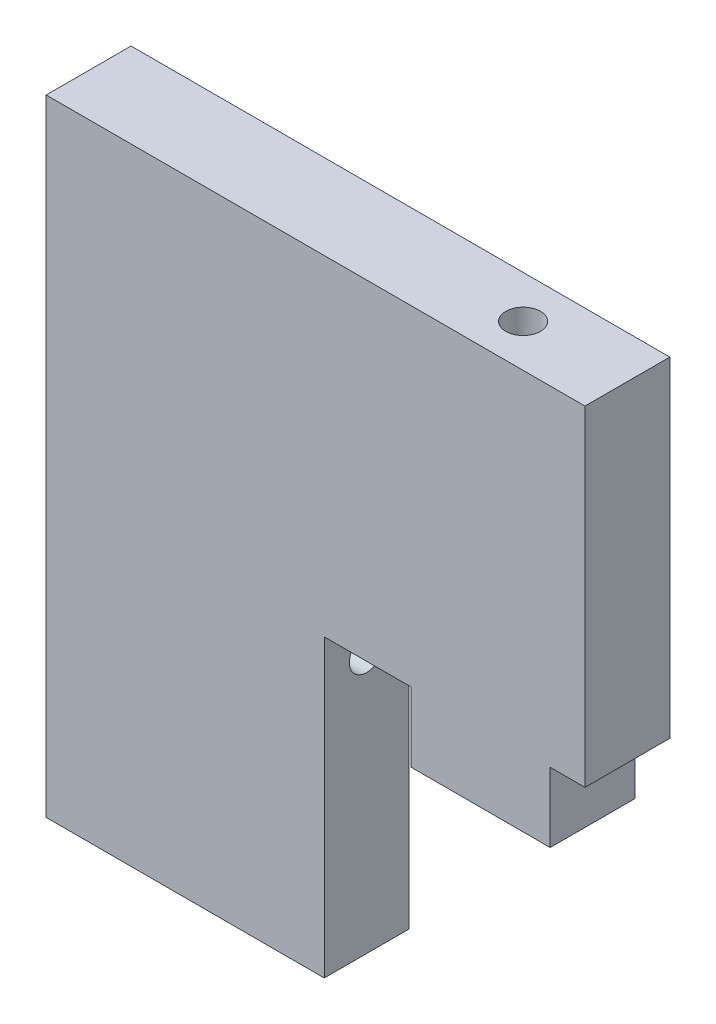
ISO-10303-21;
HEADER;
FILE_DESCRIPTION(('STEP AP214'),'2;1');
FILE_NAME('part.step','',(''),(''),'','','');
FILE_SCHEMA(('AUTOMOTIVE_DESIGN { 1 0 10303 214 1 1 1 1 }'));
ENDSEC;
DATA;
#1=APPLICATION_CONTEXT('core data for automotive mechanical design processes');
#2=APPLICATION_PROTOCOL_DEFINITION('international standard','automotive_design',2000,#1);
#3=PRODUCT_CONTEXT('',#1,'mechanical');
#4=PRODUCT('Part','Part','',(#3));
#5=PRODUCT_RELATED_PRODUCT_CATEGORY('part','',(#4));
#6=PRODUCT_DEFINITION_FORMATION('','',#4);
#7=PRODUCT_DEFINITION_CONTEXT('part definition',#1,'design');
#8=PRODUCT_DEFINITION('design','',#6,#7);
#9=PRODUCT_DEFINITION_SHAPE('','',#8);
#10=(LENGTH_UNIT() NAMED_UNIT(*) SI_UNIT(.MILLI.,.METRE.));
#11=(NAMED_UNIT(*) PLANE_ANGLE_UNIT() SI_UNIT($,.RADIAN.));
#12=(NAMED_UNIT(*) SI_UNIT($,.STERADIAN.) SOLID_ANGLE_UNIT());
#13=UNCERTAINTY_MEASURE_WITH_UNIT(LENGTH_MEASURE(1.E-05),#10,'distance_accuracy_value','');
#14=(GEOMETRIC_REPRESENTATION_CONTEXT(3) GLOBAL_UNCERTAINTY_ASSIGNED_CONTEXT((#13)) GLOBAL_UNIT_ASSIGNED_CONTEXT((#10,
#11,#12)) REPRESENTATION_CONTEXT('',''));
#15=CARTESIAN_POINT('',(0.,0.,0.));
#16=DIRECTION('',(0.,0.,1.));
#17=DIRECTION('',(1.,0.,0.));
#18=AXIS2_PLACEMENT_3D('',#15,#16,#17);
#19=CARTESIAN_POINT('',(76.2,266.7,31.));
#20=DIRECTION('',(-1.,0.,0.));
#21=DIRECTION('',(0.,-1.,0.));
#22=AXIS2_PLACEMENT_3D('',#19,#20,#21);
#23=PLANE('',#22);
#24=DIRECTION('',(0.,1.,0.));
#25=VECTOR('',#24,1.);
#26=CARTESIAN_POINT('',(76.2,266.7,-31.));
#27=LINE('',#26,#25);
#28=CARTESIAN_POINT('',(76.2,25.4,-31.));
#29=VERTEX_POINT('',#28);
#30=CARTESIAN_POINT('',(76.2,266.7,-31.));
#31=VERTEX_POINT('',#30);
#32=EDGE_CURVE('E161',#29,#31,#27,.T.);
#33=ORIENTED_EDGE('',*,*,#32,.T.);
#34=DIRECTION('',(0.,0.,-1.));
#35=VECTOR('',#34,1.);
#36=CARTESIAN_POINT('',(76.2,266.7,31.));
#37=LINE('',#36,#35);
#38=CARTESIAN_POINT('',(76.2,266.7,31.));
#39=VERTEX_POINT('',#38);
#40=EDGE_CURVE('E200',#39,#31,#37,.T.);
#41=ORIENTED_EDGE('',*,*,#40,.F.);
#42=DIRECTION('',(0.,1.,0.));
#43=VECTOR('',#42,1.);
#44=CARTESIAN_POINT('',(76.2,266.7,31.));
#45=LINE('',#44,#43);
#46=CARTESIAN_POINT('',(76.2,25.4,31.));
#47=VERTEX_POINT('',#46);
#48=EDGE_CURVE('E181',#47,#39,#45,.T.);
#49=ORIENTED_EDGE('',*,*,#48,.F.);
#50=DIRECTION('',(0.,0.,-1.));
#51=VECTOR('',#50,1.);
#52=CARTESIAN_POINT('',(76.2,25.4,31.));
#53=LINE('',#52,#51);
#54=EDGE_CURVE('E157',#47,#29,#53,.T.);
#55=ORIENTED_EDGE('',*,*,#54,.T.);
#56=EDGE_LOOP('',(#33,#41,#49,#55));
#57=FACE_BOUND('',#56,.T.);
#58=ADVANCED_FACE('F44',(#57),#23,.F.);
#59=CARTESIAN_POINT('',(76.2,266.7,31.));
#60=DIRECTION('',(0.,-1.,0.));
#61=DIRECTION('',(1.,0.,0.));
#62=AXIS2_PLACEMENT_3D('',#59,#60,#61);
#63=PLANE('',#62);
#64=CARTESIAN_POINT('',(0.,266.7,0.));
#65=DIRECTION('',(0.,1.,0.));
#66=DIRECTION('',(0.,0.,1.));
#67=AXIS2_PLACEMENT_3D('',#64,#65,#66);
#68=CIRCLE('',#67,12.7);
#69=CARTESIAN_POINT('',(0.,266.7,12.7));
#70=VERTEX_POINT('',#69);
#71=EDGE_CURVE('E396',#70,#70,#68,.T.);
#72=ORIENTED_EDGE('',*,*,#71,.F.);
#73=EDGE_LOOP('',(#72));
#74=FACE_BOUND('',#73,.T.);
#75=DIRECTION('',(-1.,0.,0.));
#76=VECTOR('',#75,1.);
#77=CARTESIAN_POINT('',(76.2,266.7,-31.));
#78=LINE('',#77,#76);
#79=CARTESIAN_POINT('',(-317.5,266.7,-31.));
#80=VERTEX_POINT('',#79);
#81=EDGE_CURVE('E164',#31,#80,#78,.T.);
#82=ORIENTED_EDGE('',*,*,#81,.T.);
#83=DIRECTION('',(0.,0.,-1.));
#84=VECTOR('',#83,1.);
#85=CARTESIAN_POINT('',(-317.5,266.7,31.));
#86=LINE('',#85,#84);
#87=CARTESIAN_POINT('',(-317.5,266.7,31.));
#88=VERTEX_POINT('',#87);
#89=EDGE_CURVE('E197',#88,#80,#86,.T.);
#90=ORIENTED_EDGE('',*,*,#89,.F.);
#91=DIRECTION('',(-1.,0.,0.));
#92=VECTOR('',#91,1.);
#93=CARTESIAN_POINT('',(76.2,266.7,31.));
#94=LINE('',#93,#92);
#95=EDGE_CURVE('E113',#39,#88,#94,.T.);
#96=ORIENTED_EDGE('',*,*,#95,.F.);
#97=ORIENTED_EDGE('',*,*,#40,.T.);
#98=EDGE_LOOP('',(#82,#90,#96,#97));
#99=FACE_BOUND('',#98,.T.);
#100=ADVANCED_FACE('F260',(#74,#99),#63,.F.);
#101=CARTESIAN_POINT('',(-317.5,266.7,31.));
#102=DIRECTION('',(1.,0.,0.));
#103=DIRECTION('',(0.,1.,0.));
#104=AXIS2_PLACEMENT_3D('',#101,#102,#103);
#105=PLANE('',#104);
#106=CARTESIAN_POINT('',(-317.5,0.,0.));
#107=DIRECTION('',(1.,0.,0.));
#108=DIRECTION('',(0.,0.,-1.));
#109=AXIS2_PLACEMENT_3D('',#106,#107,#108);
#110=CIRCLE('',#109,19.05);
#111=CARTESIAN_POINT('',(-317.5,0.,19.05));
#112=VERTEX_POINT('',#111);
#113=EDGE_CURVE('E388',#112,#112,#110,.T.);
#114=ORIENTED_EDGE('',*,*,#113,.T.);
#115=EDGE_LOOP('',(#114));
#116=FACE_BOUND('',#115,.T.);
#117=DIRECTION('',(0.,-1.,0.));
#118=VECTOR('',#117,1.);
#119=CARTESIAN_POINT('',(-317.5,266.7,-31.));
#120=LINE('',#119,#118);
#121=CARTESIAN_POINT('',(-317.5,-190.5,-31.));
#122=VERTEX_POINT('',#121);
#123=EDGE_CURVE('E167',#80,#122,#120,.T.);
#124=ORIENTED_EDGE('',*,*,#123,.T.);
#125=DIRECTION('',(0.,0.,-1.));
#126=VECTOR('',#125,1.);
#127=CARTESIAN_POINT('',(-317.5,-190.5,31.));
#128=LINE('',#127,#126);
#129=CARTESIAN_POINT('',(-317.5,-190.5,31.));
#130=VERTEX_POINT('',#129);
#131=EDGE_CURVE('E194',#130,#122,#128,.T.);
#132=ORIENTED_EDGE('',*,*,#131,.F.);
#133=DIRECTION('',(0.,-1.,0.));
#134=VECTOR('',#133,1.);
#135=CARTESIAN_POINT('',(-317.5,266.7,31.));
#136=LINE('',#135,#134);
#137=EDGE_CURVE('E232',#88,#130,#136,.T.);
#138=ORIENTED_EDGE('',*,*,#137,.F.);
#139=ORIENTED_EDGE('',*,*,#89,.T.);
#140=EDGE_LOOP('',(#124,#132,#138,#139));
#141=FACE_BOUND('',#140,.T.);
#142=ADVANCED_FACE('F259',(#116,#141),#105,.F.);
#143=CARTESIAN_POINT('',(-317.5,-190.5,31.));
#144=DIRECTION('',(0.,1.,0.));
#145=DIRECTION('',(-1.,0.,0.));
#146=AXIS2_PLACEMENT_3D('',#143,#144,#145);
#147=PLANE('',#146);
#148=CARTESIAN_POINT('',(-191.30420605676,-190.5,-21.825));
#149=DIRECTION('',(0.,-1.,0.));
#150=DIRECTION('',(1.,0.,0.));
#151=AXIS2_PLACEMENT_3D('',#148,#149,#150);
#152=CIRCLE('',#151,4.99999999999999);
#153=CARTESIAN_POINT('',(-186.30420605676,-190.5,-21.825));
#154=VERTEX_POINT('',#153);
#155=EDGE_CURVE('E373',#154,#154,#152,.T.);
#156=ORIENTED_EDGE('',*,*,#155,.F.);
#157=EDGE_LOOP('',(#156));
#158=FACE_BOUND('',#157,.T.);
#159=CARTESIAN_POINT('',(-191.30420605676,-190.5,21.825));
#160=DIRECTION('',(0.,-1.,0.));
#161=DIRECTION('',(1.,0.,0.));
#162=AXIS2_PLACEMENT_3D('',#159,#160,#161);
#163=CIRCLE('',#162,4.99999999999999);
#164=CARTESIAN_POINT('',(-186.30420605676,-190.5,21.825));
#165=VERTEX_POINT('',#164);
#166=EDGE_CURVE('E367',#165,#165,#163,.T.);
#167=ORIENTED_EDGE('',*,*,#166,.F.);
#168=EDGE_LOOP('',(#167));
#169=FACE_BOUND('',#168,.T.);
#170=CARTESIAN_POINT('',(-241.30420605676,-190.5,-21.825));
#171=DIRECTION('',(0.,-1.,0.));
#172=DIRECTION('',(1.,0.,0.));
#173=AXIS2_PLACEMENT_3D('',#170,#171,#172);
#174=CIRCLE('',#173,4.99999999999999);
#175=CARTESIAN_POINT('',(-236.30420605676,-190.5,-21.825));
#176=VERTEX_POINT('',#175);
#177=EDGE_CURVE('E356',#176,#176,#174,.T.);
#178=ORIENTED_EDGE('',*,*,#177,.F.);
#179=EDGE_LOOP('',(#178));
#180=FACE_BOUND('',#179,.T.);
#181=CARTESIAN_POINT('',(-241.30420605676,-190.5,21.825));
#182=DIRECTION('',(0.,-1.,0.));
#183=DIRECTION('',(1.,0.,0.));
#184=AXIS2_PLACEMENT_3D('',#181,#182,#183);
#185=CIRCLE('',#184,4.99999999999999);
#186=CARTESIAN_POINT('',(-236.30420605676,-190.5,21.825));
#187=VERTEX_POINT('',#186);
#188=EDGE_CURVE('E355',#187,#187,#185,.T.);
#189=ORIENTED_EDGE('',*,*,#188,.F.);
#190=EDGE_LOOP('',(#189));
#191=FACE_BOUND('',#190,.T.);
#192=CARTESIAN_POINT('',(-291.30420605676,-190.5,-21.825));
#193=DIRECTION('',(0.,-1.,0.));
#194=DIRECTION('',(1.,0.,0.));
#195=AXIS2_PLACEMENT_3D('',#192,#193,#194);
#196=CIRCLE('',#195,4.99999999999999);
#197=CARTESIAN_POINT('',(-286.30420605676,-190.5,-21.825));
#198=VERTEX_POINT('',#197);
#199=EDGE_CURVE('E380',#198,#198,#196,.T.);
#200=ORIENTED_EDGE('',*,*,#199,.F.);
#201=EDGE_LOOP('',(#200));
#202=FACE_BOUND('',#201,.T.);
#203=CARTESIAN_POINT('',(-291.30420605676,-190.5,21.825));
#204=DIRECTION('',(0.,-1.,0.));
#205=DIRECTION('',(1.,0.,0.));
#206=AXIS2_PLACEMENT_3D('',#203,#204,#205);
#207=CIRCLE('',#206,4.99999999999999);
#208=CARTESIAN_POINT('',(-286.30420605676,-190.5,21.825));
#209=VERTEX_POINT('',#208);
#210=EDGE_CURVE('E379',#209,#209,#207,.T.);
#211=ORIENTED_EDGE('',*,*,#210,.F.);
#212=EDGE_LOOP('',(#211));
#213=FACE_BOUND('',#212,.T.);
#214=DIRECTION('',(1.,0.,0.));
#215=VECTOR('',#214,1.);
#216=CARTESIAN_POINT('',(-317.5,-190.5,-31.));
#217=LINE('',#216,#215);
#218=CARTESIAN_POINT('',(-114.3,-190.5,-31.));
#219=VERTEX_POINT('',#218);
#220=EDGE_CURVE('E169',#122,#219,#217,.T.);
#221=ORIENTED_EDGE('',*,*,#220,.T.);
#222=DIRECTION('',(0.,0.,-1.));
#223=VECTOR('',#222,1.);
#224=CARTESIAN_POINT('',(-114.3,-190.5,31.));
#225=LINE('',#224,#223);
#226=CARTESIAN_POINT('',(-114.3,-190.5,31.));
#227=VERTEX_POINT('',#226);
#228=EDGE_CURVE('E191',#227,#219,#225,.T.);
#229=ORIENTED_EDGE('',*,*,#228,.F.);
#230=DIRECTION('',(1.,0.,0.));
#231=VECTOR('',#230,1.);
#232=CARTESIAN_POINT('',(-317.5,-190.5,31.));
#233=LINE('',#232,#231);
#234=EDGE_CURVE('E238',#130,#227,#233,.T.);
#235=ORIENTED_EDGE('',*,*,#234,.F.);
#236=ORIENTED_EDGE('',*,*,#131,.T.);
#237=EDGE_LOOP('',(#221,#229,#235,#236));
#238=FACE_BOUND('',#237,.T.);
#239=ADVANCED_FACE('F255',(#158,#169,#180,#191,#202,#213,#238),#147,.F.);
#240=CARTESIAN_POINT('',(-114.3,25.4,31.));
#241=DIRECTION('',(-1.,0.,0.));
#242=DIRECTION('',(0.,-1.,0.));
#243=AXIS2_PLACEMENT_3D('',#240,#241,#242);
#244=PLANE('',#243);
#245=CARTESIAN_POINT('',(-114.3,0.,0.));
#246=DIRECTION('',(-1.,0.,0.));
#247=DIRECTION('',(0.,-1.,0.));
#248=AXIS2_PLACEMENT_3D('',#245,#246,#247);
#249=CIRCLE('',#248,12.7);
#250=CARTESIAN_POINT('',(-114.3,-12.7,0.));
#251=VERTEX_POINT('',#250);
#252=EDGE_CURVE('E165',#251,#251,#249,.F.);
#253=ORIENTED_EDGE('',*,*,#252,.F.);
#254=EDGE_LOOP('',(#253));
#255=FACE_BOUND('',#254,.T.);
#256=DIRECTION('',(0.,1.,0.));
#257=VECTOR('',#256,1.);
#258=CARTESIAN_POINT('',(-114.3,25.4,-31.));
#259=LINE('',#258,#257);
#260=CARTESIAN_POINT('',(-114.3,25.4,-31.));
#261=VERTEX_POINT('',#260);
#262=EDGE_CURVE('E171',#219,#261,#259,.T.);
#263=ORIENTED_EDGE('',*,*,#262,.T.);
#264=DIRECTION('',(0.,0.,-1.));
#265=VECTOR('',#264,1.);
#266=CARTESIAN_POINT('',(-114.3,25.4,31.));
#267=LINE('',#266,#265);
#268=CARTESIAN_POINT('',(-114.3,25.4,31.));
#269=VERTEX_POINT('',#268);
#270=EDGE_CURVE('E188',#269,#261,#267,.T.);
#271=ORIENTED_EDGE('',*,*,#270,.F.);
#272=DIRECTION('',(0.,1.,0.));
#273=VECTOR('',#272,1.);
#274=CARTESIAN_POINT('',(-114.3,25.4,31.));
#275=LINE('',#274,#273);
#276=EDGE_CURVE('E240',#227,#269,#275,.T.);
#277=ORIENTED_EDGE('',*,*,#276,.F.);
#278=ORIENTED_EDGE('',*,*,#228,.T.);
#279=EDGE_LOOP('',(#263,#271,#277,#278));
#280=FACE_BOUND('',#279,.T.);
#281=ADVANCED_FACE('F251',(#255,#280),#244,.F.);
#282=CARTESIAN_POINT('',(-50.8,25.4,31.));
#283=DIRECTION('',(0.,1.,0.));
#284=DIRECTION('',(-1.,0.,0.));
#285=AXIS2_PLACEMENT_3D('',#282,#283,#284);
#286=PLANE('',#285);
#287=DIRECTION('',(1.,0.,0.));
#288=VECTOR('',#287,1.);
#289=CARTESIAN_POINT('',(-50.8,25.4,-31.));
#290=LINE('',#289,#288);
#291=CARTESIAN_POINT('',(-50.8,25.4,-31.));
#292=VERTEX_POINT('',#291);
#293=EDGE_CURVE('E173',#261,#292,#290,.T.);
#294=ORIENTED_EDGE('',*,*,#293,.T.);
#295=DIRECTION('',(0.,0.,-1.));
#296=VECTOR('',#295,1.);
#297=CARTESIAN_POINT('',(-50.8,25.4,31.));
#298=LINE('',#297,#296);
#299=CARTESIAN_POINT('',(-50.8,25.4,31.));
#300=VERTEX_POINT('',#299);
#301=EDGE_CURVE('E185',#300,#292,#298,.T.);
#302=ORIENTED_EDGE('',*,*,#301,.F.);
#303=DIRECTION('',(1.,0.,0.));
#304=VECTOR('',#303,1.);
#305=CARTESIAN_POINT('',(-50.8,25.4,31.));
#306=LINE('',#305,#304);
#307=EDGE_CURVE('E242',#269,#300,#306,.T.);
#308=ORIENTED_EDGE('',*,*,#307,.F.);
#309=ORIENTED_EDGE('',*,*,#270,.T.);
#310=EDGE_LOOP('',(#294,#302,#308,#309));
#311=FACE_BOUND('',#310,.T.);
#312=ADVANCED_FACE('F220',(#311),#286,.F.);
#313=CARTESIAN_POINT('',(-50.8,25.4,31.));
#314=DIRECTION('',(1.,0.,0.));
#315=DIRECTION('',(0.,1.,0.));
#316=AXIS2_PLACEMENT_3D('',#313,#314,#315);
#317=PLANE('',#316);
#318=CARTESIAN_POINT('',(-50.8,0.,0.));
#319=DIRECTION('',(1.,0.,0.));
#320=DIRECTION('',(0.,1.,0.));
#321=AXIS2_PLACEMENT_3D('',#318,#319,#320);
#322=CIRCLE('',#321,12.7);
#323=CARTESIAN_POINT('',(-50.8,12.7,0.));
#324=VERTEX_POINT('',#323);
#325=EDGE_CURVE('E202',#324,#324,#322,.F.);
#326=ORIENTED_EDGE('',*,*,#325,.F.);
#327=EDGE_LOOP('',(#326));
#328=FACE_BOUND('',#327,.T.);
#329=DIRECTION('',(0.,-1.,0.));
#330=VECTOR('',#329,1.);
#331=CARTESIAN_POINT('',(-50.8,25.4,-31.));
#332=LINE('',#331,#330);
#333=CARTESIAN_POINT('',(-50.8,-25.4,-31.));
#334=VERTEX_POINT('',#333);
#335=EDGE_CURVE('E175',#292,#334,#332,.T.);
#336=ORIENTED_EDGE('',*,*,#335,.T.);
#337=DIRECTION('',(0.,0.,-1.));
#338=VECTOR('',#337,1.);
#339=CARTESIAN_POINT('',(-50.8,-25.4,31.));
#340=LINE('',#339,#338);
#341=CARTESIAN_POINT('',(-50.8,-25.4,31.));
#342=VERTEX_POINT('',#341);
#343=EDGE_CURVE('E152',#342,#334,#340,.T.);
#344=ORIENTED_EDGE('',*,*,#343,.F.);
#345=DIRECTION('',(0.,-1.,0.));
#346=VECTOR('',#345,1.);
#347=CARTESIAN_POINT('',(-50.8,25.4,31.));
#348=LINE('',#347,#346);
#349=EDGE_CURVE('E140',#300,#342,#348,.T.);
#350=ORIENTED_EDGE('',*,*,#349,.F.);
#351=ORIENTED_EDGE('',*,*,#301,.T.);
#352=EDGE_LOOP('',(#336,#344,#350,#351));
#353=FACE_BOUND('',#352,.T.);
#354=ADVANCED_FACE('F217',(#328,#353),#317,.F.);
#355=CARTESIAN_POINT('',(50.8,-25.4,31.));
#356=DIRECTION('',(0.,1.,0.));
#357=DIRECTION('',(-1.,0.,0.));
#358=AXIS2_PLACEMENT_3D('',#355,#356,#357);
#359=PLANE('',#358);
#360=CARTESIAN_POINT('',(0.,-25.4,0.));
#361=DIRECTION('',(0.,1.,0.));
#362=DIRECTION('',(-1.,0.,0.));
#363=AXIS2_PLACEMENT_3D('',#360,#361,#362);
#364=CIRCLE('',#363,12.7);
#365=CARTESIAN_POINT('',(-12.7,-25.4,0.));
#366=VERTEX_POINT('',#365);
#367=EDGE_CURVE('E205',#366,#366,#364,.T.);
#368=ORIENTED_EDGE('',*,*,#367,.T.);
#369=EDGE_LOOP('',(#368));
#370=FACE_BOUND('',#369,.T.);
#371=DIRECTION('',(1.,0.,0.));
#372=VECTOR('',#371,1.);
#373=CARTESIAN_POINT('',(50.8,-25.4,-31.));
#374=LINE('',#373,#372);
#375=CARTESIAN_POINT('',(50.8,-25.4,-31.));
#376=VERTEX_POINT('',#375);
#377=EDGE_CURVE('E149',#334,#376,#374,.T.);
#378=ORIENTED_EDGE('',*,*,#377,.T.);
#379=DIRECTION('',(0.,0.,-1.));
#380=VECTOR('',#379,1.);
#381=CARTESIAN_POINT('',(50.8,-25.4,31.));
#382=LINE('',#381,#380);
#383=CARTESIAN_POINT('',(50.8,-25.4,31.));
#384=VERTEX_POINT('',#383);
#385=EDGE_CURVE('E146',#384,#376,#382,.T.);
#386=ORIENTED_EDGE('',*,*,#385,.F.);
#387=DIRECTION('',(1.,0.,0.));
#388=VECTOR('',#387,1.);
#389=CARTESIAN_POINT('',(50.8,-25.4,31.));
#390=LINE('',#389,#388);
#391=EDGE_CURVE('E133',#342,#384,#390,.T.);
#392=ORIENTED_EDGE('',*,*,#391,.F.);
#393=ORIENTED_EDGE('',*,*,#343,.T.);
#394=EDGE_LOOP('',(#378,#386,#392,#393));
#395=FACE_BOUND('',#394,.T.);
#396=ADVANCED_FACE('F147',(#370,#395),#359,.F.);
#397=CARTESIAN_POINT('',(50.8,25.4,31.));
#398=DIRECTION('',(-1.,0.,0.));
#399=DIRECTION('',(0.,0.,1.));
#400=AXIS2_PLACEMENT_3D('',#397,#398,#399);
#401=PLANE('',#400);
#402=DIRECTION('',(0.,1.,0.));
#403=VECTOR('',#402,1.);
#404=CARTESIAN_POINT('',(50.8,25.4,-31.));
#405=LINE('',#404,#403);
#406=CARTESIAN_POINT('',(50.8,25.4,-31.));
#407=VERTEX_POINT('',#406);
#408=EDGE_CURVE('E178',#376,#407,#405,.T.);
#409=ORIENTED_EDGE('',*,*,#408,.T.);
#410=DIRECTION('',(0.,0.,-1.));
#411=VECTOR('',#410,1.);
#412=CARTESIAN_POINT('',(50.8,25.4,31.));
#413=LINE('',#412,#411);
#414=CARTESIAN_POINT('',(50.8,25.4,31.));
#415=VERTEX_POINT('',#414);
#416=EDGE_CURVE('E153',#415,#407,#413,.T.);
#417=ORIENTED_EDGE('',*,*,#416,.F.);
#418=DIRECTION('',(0.,1.,0.));
#419=VECTOR('',#418,1.);
#420=CARTESIAN_POINT('',(50.8,25.4,31.));
#421=LINE('',#420,#419);
#422=EDGE_CURVE('E137',#384,#415,#421,.T.);
#423=ORIENTED_EDGE('',*,*,#422,.F.);
#424=ORIENTED_EDGE('',*,*,#385,.T.);
#425=EDGE_LOOP('',(#409,#417,#423,#424));
#426=FACE_BOUND('',#425,.T.);
#427=ADVANCED_FACE('F155',(#426),#401,.F.);
#428=CARTESIAN_POINT('',(76.2,25.4,31.));
#429=DIRECTION('',(0.,1.,0.));
#430=DIRECTION('',(-1.,0.,0.));
#431=AXIS2_PLACEMENT_3D('',#428,#429,#430);
#432=PLANE('',#431);
#433=DIRECTION('',(1.,0.,0.));
#434=VECTOR('',#433,1.);
#435=CARTESIAN_POINT('',(76.2,25.4,-31.));
#436=LINE('',#435,#434);
#437=EDGE_CURVE('E104',#407,#29,#436,.T.);
#438=ORIENTED_EDGE('',*,*,#437,.T.);
#439=ORIENTED_EDGE('',*,*,#54,.F.);
#440=DIRECTION('',(1.,0.,0.));
#441=VECTOR('',#440,1.);
#442=CARTESIAN_POINT('',(76.2,25.4,31.));
#443=LINE('',#442,#441);
#444=EDGE_CURVE('E65',#415,#47,#443,.T.);
#445=ORIENTED_EDGE('',*,*,#444,.F.);
#446=ORIENTED_EDGE('',*,*,#416,.T.);
#447=EDGE_LOOP('',(#438,#439,#445,#446));
#448=FACE_BOUND('',#447,.T.);
#449=ADVANCED_FACE('F227',(#448),#432,.F.);
#450=CARTESIAN_POINT('',(0.,0.,31.));
#451=DIRECTION('',(0.,0.,-1.));
#452=DIRECTION('',(-1.,0.,0.));
#453=AXIS2_PLACEMENT_3D('',#450,#451,#452);
#454=PLANE('',#453);
#455=ORIENTED_EDGE('',*,*,#48,.T.);
#456=ORIENTED_EDGE('',*,*,#95,.T.);
#457=ORIENTED_EDGE('',*,*,#137,.T.);
#458=ORIENTED_EDGE('',*,*,#234,.T.);
#459=ORIENTED_EDGE('',*,*,#276,.T.);
#460=ORIENTED_EDGE('',*,*,#307,.T.);
#461=ORIENTED_EDGE('',*,*,#349,.T.);
#462=ORIENTED_EDGE('',*,*,#391,.T.);
#463=ORIENTED_EDGE('',*,*,#422,.T.);
#464=ORIENTED_EDGE('',*,*,#444,.T.);
#465=EDGE_LOOP('',(#455,#456,#457,#458,#459,#460,#461,#462,#463,#464));
#466=FACE_BOUND('',#465,.T.);
#467=ADVANCED_FACE('F135',(#466),#454,.F.);
#468=CARTESIAN_POINT('',(0.,0.,-31.));
#469=DIRECTION('',(0.,0.,-1.));
#470=DIRECTION('',(-1.,0.,0.));
#471=AXIS2_PLACEMENT_3D('',#468,#469,#470);
#472=PLANE('',#471);
#473=ORIENTED_EDGE('',*,*,#32,.F.);
#474=ORIENTED_EDGE('',*,*,#437,.F.);
#475=ORIENTED_EDGE('',*,*,#408,.F.);
#476=ORIENTED_EDGE('',*,*,#377,.F.);
#477=ORIENTED_EDGE('',*,*,#335,.F.);
#478=ORIENTED_EDGE('',*,*,#293,.F.);
#479=ORIENTED_EDGE('',*,*,#262,.F.);
#480=ORIENTED_EDGE('',*,*,#220,.F.);
#481=ORIENTED_EDGE('',*,*,#123,.F.);
#482=ORIENTED_EDGE('',*,*,#81,.F.);
#483=EDGE_LOOP('',(#473,#474,#475,#476,#477,#478,#479,#480,#481,#482));
#484=FACE_BOUND('',#483,.T.);
#485=ADVANCED_FACE('F213',(#484),#472,.T.);
#486=CARTESIAN_POINT('',(35.9210244842766,0.,0.));
#487=DIRECTION('',(-1.,0.,0.));
#488=DIRECTION('',(0.,0.,1.));
#489=AXIS2_PLACEMENT_3D('',#486,#487,#488);
#490=CYLINDRICAL_SURFACE('',#489,12.7);
#491=CARTESIAN_POINT('',(0.,0.,0.));
#492=DIRECTION('',(-0.707106781186547,0.707106781186547,0.));
#493=DIRECTION('',(-0.707106781186547,-0.707106781186547,0.));
#494=AXIS2_PLACEMENT_3D('',#491,#492,#493);
#495=ELLIPSE('',#494,17.9605122421383,12.7);
#496=CARTESIAN_POINT('',(0.,0.,-12.7));
#497=VERTEX_POINT('',#496);
#498=CARTESIAN_POINT('',(0.,0.,12.7));
#499=VERTEX_POINT('',#498);
#500=EDGE_CURVE('E13',#497,#499,#495,.T.);
#501=ORIENTED_EDGE('',*,*,#500,.F.);
#502=CARTESIAN_POINT('',(0.,0.,0.));
#503=DIRECTION('',(-0.707106781186547,-0.707106781186547,0.));
#504=DIRECTION('',(-0.707106781186547,0.707106781186547,0.));
#505=AXIS2_PLACEMENT_3D('',#502,#503,#504);
#506=ELLIPSE('',#505,17.9605122421383,12.7);
#507=EDGE_CURVE('E52',#499,#497,#506,.T.);
#508=ORIENTED_EDGE('',*,*,#507,.F.);
#509=EDGE_LOOP('',(#501,#508));
#510=FACE_BOUND('',#509,.T.);
#511=ORIENTED_EDGE('',*,*,#325,.T.);
#512=EDGE_LOOP('',(#511));
#513=FACE_BOUND('',#512,.T.);
#514=ADVANCED_FACE('F209',(#510,#513),#490,.F.);
#515=CARTESIAN_POINT('',(-302.26,0.,0.));
#516=DIRECTION('',(1.,0.,0.));
#517=DIRECTION('',(0.,0.,-1.));
#518=AXIS2_PLACEMENT_3D('',#515,#516,#517);
#519=CIRCLE('',#518,12.7);
#520=CARTESIAN_POINT('',(-302.26,0.,-12.7));
#521=VERTEX_POINT('',#520);
#522=EDGE_CURVE('E47',#521,#521,#519,.T.);
#523=ORIENTED_EDGE('',*,*,#522,.F.);
#524=EDGE_LOOP('',(#523));
#525=FACE_BOUND('',#524,.T.);
#526=ORIENTED_EDGE('',*,*,#252,.T.);
#527=EDGE_LOOP('',(#526));
#528=FACE_BOUND('',#527,.T.);
#529=ADVANCED_FACE('F212',(#525,#528),#490,.F.);
#530=CARTESIAN_POINT('',(0.,-190.5,0.));
#531=DIRECTION('',(0.,1.,0.));
#532=DIRECTION('',(0.,0.,1.));
#533=AXIS2_PLACEMENT_3D('',#530,#531,#532);
#534=CYLINDRICAL_SURFACE('',#533,12.7);
#535=ORIENTED_EDGE('',*,*,#71,.T.);
#536=EDGE_LOOP('',(#535));
#537=FACE_BOUND('',#536,.T.);
#538=ORIENTED_EDGE('',*,*,#500,.T.);
#539=ORIENTED_EDGE('',*,*,#507,.T.);
#540=EDGE_LOOP('',(#538,#539));
#541=FACE_BOUND('',#540,.T.);
#542=ORIENTED_EDGE('',*,*,#367,.F.);
#543=EDGE_LOOP('',(#542));
#544=FACE_BOUND('',#543,.T.);
#545=ADVANCED_FACE('F206',(#537,#541,#544),#534,.F.);
#546=CARTESIAN_POINT('',(-302.26,0.,0.));
#547=DIRECTION('',(-1.,0.,0.));
#548=DIRECTION('',(0.,0.,1.));
#549=AXIS2_PLACEMENT_3D('',#546,#547,#548);
#550=CYLINDRICAL_SURFACE('',#549,19.05);
#551=CARTESIAN_POINT('',(-302.26,0.,0.));
#552=DIRECTION('',(1.,0.,0.));
#553=DIRECTION('',(0.,0.,-1.));
#554=AXIS2_PLACEMENT_3D('',#551,#552,#553);
#555=CIRCLE('',#554,19.05);
#556=CARTESIAN_POINT('',(-302.26,0.,19.05));
#557=VERTEX_POINT('',#556);
#558=EDGE_CURVE('E391',#557,#557,#555,.T.);
#559=CARTESIAN_POINT('',(-302.26,0.,19.05));
#560=CARTESIAN_POINT('',(-302.41875,0.,19.05));
#561=CARTESIAN_POINT('',(-302.5775,0.,19.05));
#562=CARTESIAN_POINT('',(-302.895,0.,19.05));
#563=CARTESIAN_POINT('',(-303.05375,0.,19.05));
#564=CARTESIAN_POINT('',(-303.37125,0.,19.05));
#565=CARTESIAN_POINT('',(-303.53,0.,19.05));
#566=CARTESIAN_POINT('',(-303.8475,0.,19.05));
#567=CARTESIAN_POINT('',(-304.00625,0.,19.05));
#568=CARTESIAN_POINT('',(-304.32375,0.,19.05));
#569=CARTESIAN_POINT('',(-304.4825,0.,19.05));
#570=CARTESIAN_POINT('',(-304.8,0.,19.05));
#571=CARTESIAN_POINT('',(-304.95875,0.,19.05));
#572=CARTESIAN_POINT('',(-305.27625,0.,19.05));
#573=CARTESIAN_POINT('',(-305.435,0.,19.05));
#574=CARTESIAN_POINT('',(-305.7525,0.,19.05));
#575=CARTESIAN_POINT('',(-305.91125,0.,19.05));
#576=CARTESIAN_POINT('',(-306.22875,0.,19.05));
#577=CARTESIAN_POINT('',(-306.3875,0.,19.05));
#578=CARTESIAN_POINT('',(-306.705,0.,19.05));
#579=CARTESIAN_POINT('',(-306.86375,0.,19.05));
#580=CARTESIAN_POINT('',(-307.18125,0.,19.05));
#581=CARTESIAN_POINT('',(-307.34,0.,19.05));
#582=CARTESIAN_POINT('',(-307.6575,0.,19.05));
#583=CARTESIAN_POINT('',(-307.81625,0.,19.05));
#584=CARTESIAN_POINT('',(-308.13375,0.,19.05));
#585=CARTESIAN_POINT('',(-308.2925,0.,19.05));
#586=CARTESIAN_POINT('',(-308.61,0.,19.05));
#587=CARTESIAN_POINT('',(-308.76875,0.,19.05));
#588=CARTESIAN_POINT('',(-309.08625,0.,19.05));
#589=CARTESIAN_POINT('',(-309.245,0.,19.05));
#590=CARTESIAN_POINT('',(-309.5625,0.,19.05));
#591=CARTESIAN_POINT('',(-309.72125,0.,19.05));
#592=CARTESIAN_POINT('',(-310.03875,0.,19.05));
#593=CARTESIAN_POINT('',(-310.1975,0.,19.05));
#594=CARTESIAN_POINT('',(-310.515,0.,19.05));
#595=CARTESIAN_POINT('',(-310.67375,0.,19.05));
#596=CARTESIAN_POINT('',(-310.99125,0.,19.05));
#597=CARTESIAN_POINT('',(-311.15,0.,19.05));
#598=CARTESIAN_POINT('',(-311.4675,0.,19.05));
#599=CARTESIAN_POINT('',(-311.62625,0.,19.05));
#600=CARTESIAN_POINT('',(-311.94375,0.,19.05));
#601=CARTESIAN_POINT('',(-312.1025,0.,19.05));
#602=CARTESIAN_POINT('',(-312.42,0.,19.05));
#603=CARTESIAN_POINT('',(-312.57875,0.,19.05));
#604=CARTESIAN_POINT('',(-312.89625,0.,19.05));
#605=CARTESIAN_POINT('',(-313.055,0.,19.05));
#606=CARTESIAN_POINT('',(-313.3725,0.,19.05));
#607=CARTESIAN_POINT('',(-313.53125,0.,19.05));
#608=CARTESIAN_POINT('',(-313.84875,0.,19.05));
#609=CARTESIAN_POINT('',(-314.0075,0.,19.05));
#610=CARTESIAN_POINT('',(-314.325,0.,19.05));
#611=CARTESIAN_POINT('',(-314.48375,0.,19.05));
#612=CARTESIAN_POINT('',(-314.80125,0.,19.05));
#613=CARTESIAN_POINT('',(-314.96,0.,19.05));
#614=CARTESIAN_POINT('',(-315.2775,0.,19.05));
#615=CARTESIAN_POINT('',(-315.43625,0.,19.05));
#616=CARTESIAN_POINT('',(-315.75375,0.,19.05));
#617=CARTESIAN_POINT('',(-315.9125,0.,19.05));
#618=CARTESIAN_POINT('',(-316.23,0.,19.05));
#619=CARTESIAN_POINT('',(-316.38875,0.,19.05));
#620=CARTESIAN_POINT('',(-316.70625,0.,19.05));
#621=CARTESIAN_POINT('',(-316.865,0.,19.05));
#622=CARTESIAN_POINT('',(-317.1825,0.,19.05));
#623=CARTESIAN_POINT('',(-317.34125,0.,19.05));
#624=CARTESIAN_POINT('',(-317.5,0.,19.05));
#625=B_SPLINE_CURVE_WITH_KNOTS('',3,(#559,#560,#561,#562,#563,#564,#565,#566,#567,#568,#569,
#570,#571,#572,#573,#574,#575,#576,#577,#578,#579,#580,#581,#582,#583,#584,#585,#586,#587,#588,
#589,#590,#591,#592,#593,#594,#595,#596,#597,#598,#599,#600,#601,#602,#603,#604,#605,#606,#607,
#608,#609,#610,#611,#612,#613,#614,#615,#616,#617,#618,#619,#620,#621,#622,#623,#624),
.UNSPECIFIED.,.F.,.F.,(4,2,2,2,2,2,2,2,2,2,2,2,2,2,2,2,2,2,2,2,2,2,2,2,2,2,2,2,2,2,2,2,4),(0.,
0.476249999999956,0.952499999999967,1.42874999999998,1.90499999999999,2.38124999999995,
2.85749999999996,3.33374999999997,3.80999999999998,4.28624999999999,4.76249999999995,
5.23874999999996,5.71499999999997,6.19124999999998,6.66749999999994,7.14374999999995,
7.61999999999996,8.09624999999997,8.57249999999998,9.04874999999994,9.52499999999995,10.00125,
10.4775,10.9537499999999,11.4299999999999,11.90625,12.3825,12.85875,13.3349999999999,
13.8112499999999,14.2875,14.76375,15.2399999999999),.UNSPECIFIED.);
#626=EDGE_CURVE('BSEAM294',#557,#112,#625,.T.);
#627=ORIENTED_EDGE('',*,*,#558,.T.);
#628=ORIENTED_EDGE('',*,*,#113,.F.);
#629=ORIENTED_EDGE('',*,*,#626,.T.);
#630=ORIENTED_EDGE('',*,*,#626,.F.);
#631=EDGE_LOOP('',(#627,#629,#628,#630));
#632=FACE_BOUND('',#631,.T.);
#633=ADVANCED_FACE('F294',(#632),#550,.F.);
#634=CARTESIAN_POINT('',(-302.26,0.,0.));
#635=DIRECTION('',(1.,0.,0.));
#636=DIRECTION('',(0.,0.,-1.));
#637=AXIS2_PLACEMENT_3D('',#634,#635,#636);
#638=PLANE('',#637);
#639=ORIENTED_EDGE('',*,*,#522,.T.);
#640=EDGE_LOOP('',(#639));
#641=FACE_BOUND('',#640,.T.);
#642=ORIENTED_EDGE('',*,*,#558,.F.);
#643=EDGE_LOOP('',(#642));
#644=FACE_BOUND('',#643,.T.);
#645=ADVANCED_FACE('F298',(#641,#644),#638,.F.);
#646=CARTESIAN_POINT('',(-291.30420605676,-165.1,21.825));
#647=DIRECTION('',(0.,-1.,0.));
#648=DIRECTION('',(1.,0.,0.));
#649=AXIS2_PLACEMENT_3D('',#646,#647,#648);
#650=CYLINDRICAL_SURFACE('',#649,4.99999999999999);
#651=CARTESIAN_POINT('',(-291.30420605676,-165.1,21.825));
#652=DIRECTION('',(0.,-1.,0.));
#653=DIRECTION('',(1.,0.,0.));
#654=AXIS2_PLACEMENT_3D('',#651,#652,#653);
#655=CIRCLE('',#654,4.99999999999999);
#656=CARTESIAN_POINT('',(-286.30420605676,-165.1,21.825));
#657=VERTEX_POINT('',#656);
#658=EDGE_CURVE('E385',#657,#657,#655,.T.);
#659=ORIENTED_EDGE('',*,*,#658,.F.);
#660=EDGE_LOOP('',(#659));
#661=FACE_BOUND('',#660,.T.);
#662=ORIENTED_EDGE('',*,*,#210,.T.);
#663=EDGE_LOOP('',(#662));
#664=FACE_BOUND('',#663,.T.);
#665=ADVANCED_FACE('F302',(#661,#664),#650,.F.);
#666=CARTESIAN_POINT('',(-291.30420605676,-165.1,21.825));
#667=DIRECTION('',(0.,-1.,0.));
#668=DIRECTION('',(1.,0.,0.));
#669=AXIS2_PLACEMENT_3D('',#666,#667,#668);
#670=PLANE('',#669);
#671=ORIENTED_EDGE('',*,*,#658,.T.);
#672=EDGE_LOOP('',(#671));
#673=FACE_BOUND('',#672,.T.);
#674=ADVANCED_FACE('F306',(#673),#670,.T.);
#675=CARTESIAN_POINT('',(-291.30420605676,-165.1,-21.825));
#676=DIRECTION('',(0.,-1.,0.));
#677=DIRECTION('',(1.,0.,0.));
#678=AXIS2_PLACEMENT_3D('',#675,#676,#677);
#679=CYLINDRICAL_SURFACE('',#678,4.99999999999999);
#680=CARTESIAN_POINT('',(-291.30420605676,-165.1,-21.825));
#681=DIRECTION('',(0.,-1.,0.));
#682=DIRECTION('',(1.,0.,0.));
#683=AXIS2_PLACEMENT_3D('',#680,#681,#682);
#684=CIRCLE('',#683,4.99999999999999);
#685=CARTESIAN_POINT('',(-286.30420605676,-165.1,-21.825));
#686=VERTEX_POINT('',#685);
#687=EDGE_CURVE('E376',#686,#686,#684,.T.);
#688=ORIENTED_EDGE('',*,*,#687,.F.);
#689=EDGE_LOOP('',(#688));
#690=FACE_BOUND('',#689,.T.);
#691=ORIENTED_EDGE('',*,*,#199,.T.);
#692=EDGE_LOOP('',(#691));
#693=FACE_BOUND('',#692,.T.);
#694=ADVANCED_FACE('F310',(#690,#693),#679,.F.);
#695=CARTESIAN_POINT('',(-291.30420605676,-165.1,-21.825));
#696=DIRECTION('',(0.,-1.,0.));
#697=DIRECTION('',(1.,0.,0.));
#698=AXIS2_PLACEMENT_3D('',#695,#696,#697);
#699=PLANE('',#698);
#700=ORIENTED_EDGE('',*,*,#687,.T.);
#701=EDGE_LOOP('',(#700));
#702=FACE_BOUND('',#701,.T.);
#703=ADVANCED_FACE('F316',(#702),#699,.T.);
#704=CARTESIAN_POINT('',(-241.30420605676,-165.1,21.825));
#705=DIRECTION('',(0.,-1.,0.));
#706=DIRECTION('',(1.,0.,0.));
#707=AXIS2_PLACEMENT_3D('',#704,#705,#706);
#708=CYLINDRICAL_SURFACE('',#707,4.99999999999999);
#709=CARTESIAN_POINT('',(-241.30420605676,-165.1,21.825));
#710=DIRECTION('',(0.,-1.,0.));
#711=DIRECTION('',(1.,0.,0.));
#712=AXIS2_PLACEMENT_3D('',#709,#710,#711);
#713=CIRCLE('',#712,4.99999999999999);
#714=CARTESIAN_POINT('',(-236.30420605676,-165.1,21.825));
#715=VERTEX_POINT('',#714);
#716=EDGE_CURVE('E359',#715,#715,#713,.T.);
#717=ORIENTED_EDGE('',*,*,#716,.F.);
#718=EDGE_LOOP('',(#717));
#719=FACE_BOUND('',#718,.T.);
#720=ORIENTED_EDGE('',*,*,#188,.T.);
#721=EDGE_LOOP('',(#720));
#722=FACE_BOUND('',#721,.T.);
#723=ADVANCED_FACE('F312',(#719,#722),#708,.F.);
#724=CARTESIAN_POINT('',(-241.30420605676,-165.1,21.825));
#725=DIRECTION('',(0.,-1.,0.));
#726=DIRECTION('',(1.,0.,0.));
#727=AXIS2_PLACEMENT_3D('',#724,#725,#726);
#728=PLANE('',#727);
#729=ORIENTED_EDGE('',*,*,#716,.T.);
#730=EDGE_LOOP('',(#729));
#731=FACE_BOUND('',#730,.T.);
#732=ADVANCED_FACE('F315',(#731),#728,.T.);
#733=CARTESIAN_POINT('',(-241.30420605676,-165.1,-21.825));
#734=DIRECTION('',(0.,-1.,0.));
#735=DIRECTION('',(1.,0.,0.));
#736=AXIS2_PLACEMENT_3D('',#733,#734,#735);
#737=CYLINDRICAL_SURFACE('',#736,4.99999999999999);
#738=CARTESIAN_POINT('',(-241.30420605676,-165.1,-21.825));
#739=DIRECTION('',(0.,-1.,0.));
#740=DIRECTION('',(1.,0.,0.));
#741=AXIS2_PLACEMENT_3D('',#738,#739,#740);
#742=CIRCLE('',#741,4.99999999999999);
#743=CARTESIAN_POINT('',(-236.30420605676,-165.1,-21.825));
#744=VERTEX_POINT('',#743);
#745=EDGE_CURVE('E354',#744,#744,#742,.T.);
#746=ORIENTED_EDGE('',*,*,#745,.F.);
#747=EDGE_LOOP('',(#746));
#748=FACE_BOUND('',#747,.T.);
#749=ORIENTED_EDGE('',*,*,#177,.T.);
#750=EDGE_LOOP('',(#749));
#751=FACE_BOUND('',#750,.T.);
#752=ADVANCED_FACE('F320',(#748,#751),#737,.F.);
#753=CARTESIAN_POINT('',(-241.30420605676,-165.1,-21.825));
#754=DIRECTION('',(0.,-1.,0.));
#755=DIRECTION('',(1.,0.,0.));
#756=AXIS2_PLACEMENT_3D('',#753,#754,#755);
#757=PLANE('',#756);
#758=ORIENTED_EDGE('',*,*,#745,.T.);
#759=EDGE_LOOP('',(#758));
#760=FACE_BOUND('',#759,.T.);
#761=ADVANCED_FACE('F340',(#760),#757,.T.);
#762=CARTESIAN_POINT('',(-191.30420605676,-165.1,21.825));
#763=DIRECTION('',(0.,-1.,0.));
#764=DIRECTION('',(1.,0.,0.));
#765=AXIS2_PLACEMENT_3D('',#762,#763,#764);
#766=CYLINDRICAL_SURFACE('',#765,4.99999999999999);
#767=CARTESIAN_POINT('',(-191.30420605676,-165.1,21.825));
#768=DIRECTION('',(0.,-1.,0.));
#769=DIRECTION('',(1.,0.,0.));
#770=AXIS2_PLACEMENT_3D('',#767,#768,#769);
#771=CIRCLE('',#770,4.99999999999999);
#772=CARTESIAN_POINT('',(-186.30420605676,-165.1,21.825));
#773=VERTEX_POINT('',#772);
#774=EDGE_CURVE('E362',#773,#773,#771,.T.);
#775=ORIENTED_EDGE('',*,*,#774,.F.);
#776=EDGE_LOOP('',(#775));
#777=FACE_BOUND('',#776,.T.);
#778=ORIENTED_EDGE('',*,*,#166,.T.);
#779=EDGE_LOOP('',(#778));
#780=FACE_BOUND('',#779,.T.);
#781=ADVANCED_FACE('F337',(#777,#780),#766,.F.);
#782=CARTESIAN_POINT('',(-191.30420605676,-165.1,21.825));
#783=DIRECTION('',(0.,-1.,0.));
#784=DIRECTION('',(1.,0.,0.));
#785=AXIS2_PLACEMENT_3D('',#782,#783,#784);
#786=PLANE('',#785);
#787=ORIENTED_EDGE('',*,*,#774,.T.);
#788=EDGE_LOOP('',(#787));
#789=FACE_BOUND('',#788,.T.);
#790=ADVANCED_FACE('F332',(#789),#786,.T.);
#791=CARTESIAN_POINT('',(-191.30420605676,-165.1,-21.825));
#792=DIRECTION('',(0.,-1.,0.));
#793=DIRECTION('',(1.,0.,0.));
#794=AXIS2_PLACEMENT_3D('',#791,#792,#793);
#795=CYLINDRICAL_SURFACE('',#794,4.99999999999999);
#796=CARTESIAN_POINT('',(-191.30420605676,-165.1,-21.825));
#797=DIRECTION('',(0.,-1.,0.));
#798=DIRECTION('',(1.,0.,0.));
#799=AXIS2_PLACEMENT_3D('',#796,#797,#798);
#800=CIRCLE('',#799,4.99999999999999);
#801=CARTESIAN_POINT('',(-186.30420605676,-165.1,-21.825));
#802=VERTEX_POINT('',#801);
#803=EDGE_CURVE('E370',#802,#802,#800,.T.);
#804=ORIENTED_EDGE('',*,*,#803,.F.);
#805=EDGE_LOOP('',(#804));
#806=FACE_BOUND('',#805,.T.);
#807=ORIENTED_EDGE('',*,*,#155,.T.);
#808=EDGE_LOOP('',(#807));
#809=FACE_BOUND('',#808,.T.);
#810=ADVANCED_FACE('F328',(#806,#809),#795,.F.);
#811=CARTESIAN_POINT('',(-191.30420605676,-165.1,-21.825));
#812=DIRECTION('',(0.,-1.,0.));
#813=DIRECTION('',(1.,0.,0.));
#814=AXIS2_PLACEMENT_3D('',#811,#812,#813);
#815=PLANE('',#814);
#816=ORIENTED_EDGE('',*,*,#803,.T.);
#817=EDGE_LOOP('',(#816));
#818=FACE_BOUND('',#817,.T.);
#819=ADVANCED_FACE('F331',(#818),#815,.T.);
#820=CLOSED_SHELL('',(#58,#100,#142,#239,#281,#312,#354,#396,#427,#449,#467,#485,#514,#529,#545,
#633,#645,#665,#674,#694,#703,#723,#732,#752,#761,#781,#790,#810,#819));
#821=MANIFOLD_SOLID_BREP('B2',#820);
#822=ADVANCED_BREP_SHAPE_REPRESENTATION('',(#18,#821),#14);
#823=SHAPE_DEFINITION_REPRESENTATION(#9,#822);
ENDSEC;
END-ISO-10303-21;
